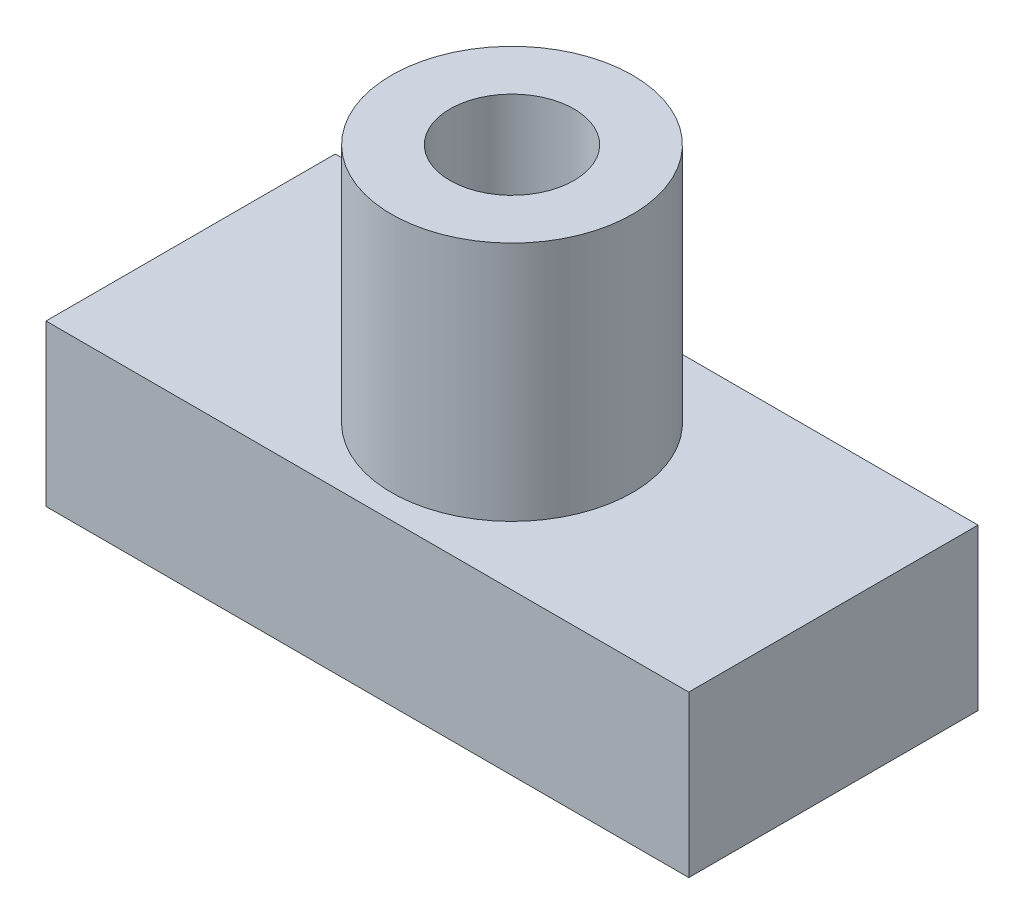
ISO-10303-21;
HEADER;
FILE_DESCRIPTION(('STEP AP214'),'2;1');
FILE_NAME('part.step','',(''),(''),'','','');
FILE_SCHEMA(('AUTOMOTIVE_DESIGN { 1 0 10303 214 1 1 1 1 }'));
ENDSEC;
DATA;
#1=APPLICATION_CONTEXT('core data for automotive mechanical design processes');
#2=APPLICATION_PROTOCOL_DEFINITION('international standard','automotive_design',2000,#1);
#3=PRODUCT_CONTEXT('',#1,'mechanical');
#4=PRODUCT('Part','Part','',(#3));
#5=PRODUCT_RELATED_PRODUCT_CATEGORY('part','',(#4));
#6=PRODUCT_DEFINITION_FORMATION('','',#4);
#7=PRODUCT_DEFINITION_CONTEXT('part definition',#1,'design');
#8=PRODUCT_DEFINITION('design','',#6,#7);
#9=PRODUCT_DEFINITION_SHAPE('','',#8);
#10=(LENGTH_UNIT() NAMED_UNIT(*) SI_UNIT(.MILLI.,.METRE.));
#11=(NAMED_UNIT(*) PLANE_ANGLE_UNIT() SI_UNIT($,.RADIAN.));
#12=(NAMED_UNIT(*) SI_UNIT($,.STERADIAN.) SOLID_ANGLE_UNIT());
#13=UNCERTAINTY_MEASURE_WITH_UNIT(LENGTH_MEASURE(1.E-05),#10,'distance_accuracy_value','');
#14=(GEOMETRIC_REPRESENTATION_CONTEXT(3) GLOBAL_UNCERTAINTY_ASSIGNED_CONTEXT((#13)) GLOBAL_UNIT_ASSIGNED_CONTEXT((#10,
#11,#12)) REPRESENTATION_CONTEXT('',''));
#15=CARTESIAN_POINT('',(0.,0.,0.));
#16=DIRECTION('',(0.,0.,1.));
#17=DIRECTION('',(1.,0.,0.));
#18=AXIS2_PLACEMENT_3D('',#15,#16,#17);
#19=CARTESIAN_POINT('',(0.,6.35,0.));
#20=DIRECTION('',(0.,-1.,0.));
#21=DIRECTION('',(0.,0.,-1.));
#22=AXIS2_PLACEMENT_3D('',#19,#20,#21);
#23=PLANE('',#22);
#24=DIRECTION('',(0.,0.,1.));
#25=VECTOR('',#24,1.);
#26=CARTESIAN_POINT('',(0.,6.35,0.));
#27=LINE('',#26,#25);
#28=CARTESIAN_POINT('',(0.,6.35,-11.43));
#29=VERTEX_POINT('',#28);
#30=CARTESIAN_POINT('',(0.,6.35,0.));
#31=VERTEX_POINT('',#30);
#32=EDGE_CURVE('E140',#29,#31,#27,.T.);
#33=ORIENTED_EDGE('',*,*,#32,.T.);
#34=DIRECTION('',(1.,0.,0.));
#35=VECTOR('',#34,1.);
#36=CARTESIAN_POINT('',(0.,6.35,0.));
#37=LINE('',#36,#35);
#38=CARTESIAN_POINT('',(25.4,6.35,0.));
#39=VERTEX_POINT('',#38);
#40=EDGE_CURVE('E84',#31,#39,#37,.T.);
#41=ORIENTED_EDGE('',*,*,#40,.T.);
#42=DIRECTION('',(0.,0.,-1.));
#43=VECTOR('',#42,1.);
#44=CARTESIAN_POINT('',(25.4,6.35,0.));
#45=LINE('',#44,#43);
#46=CARTESIAN_POINT('',(25.4,6.35,-11.43));
#47=VERTEX_POINT('',#46);
#48=EDGE_CURVE('E143',#39,#47,#45,.T.);
#49=ORIENTED_EDGE('',*,*,#48,.T.);
#50=DIRECTION('',(-1.,0.,0.));
#51=VECTOR('',#50,1.);
#52=CARTESIAN_POINT('',(0.,6.35,-11.43));
#53=LINE('',#52,#51);
#54=EDGE_CURVE('E52',#47,#29,#53,.T.);
#55=ORIENTED_EDGE('',*,*,#54,.T.);
#56=EDGE_LOOP('',(#33,#41,#49,#55));
#57=FACE_BOUND('',#56,.T.);
#58=CARTESIAN_POINT('',(12.7,6.35,-5.715));
#59=DIRECTION('',(0.,-1.,0.));
#60=DIRECTION('',(0.,0.,-1.));
#61=AXIS2_PLACEMENT_3D('',#58,#59,#60);
#62=CIRCLE('',#61,4.76250000000001);
#63=CARTESIAN_POINT('',(12.7,6.35,-10.4775));
#64=VERTEX_POINT('',#63);
#65=EDGE_CURVE('E11',#64,#64,#62,.F.);
#66=ORIENTED_EDGE('',*,*,#65,.F.);
#67=EDGE_LOOP('',(#66));
#68=FACE_BOUND('',#67,.T.);
#69=ADVANCED_FACE('F35',(#57,#68),#23,.F.);
#70=CARTESIAN_POINT('',(0.,6.35,0.));
#71=DIRECTION('',(1.,0.,0.));
#72=DIRECTION('',(0.,0.,-1.));
#73=AXIS2_PLACEMENT_3D('',#70,#71,#72);
#74=PLANE('',#73);
#75=DIRECTION('',(0.,0.,1.));
#76=VECTOR('',#75,1.);
#77=CARTESIAN_POINT('',(0.,0.,0.));
#78=LINE('',#77,#76);
#79=CARTESIAN_POINT('',(0.,0.,-11.43));
#80=VERTEX_POINT('',#79);
#81=CARTESIAN_POINT('',(0.,0.,0.));
#82=VERTEX_POINT('',#81);
#83=EDGE_CURVE('E139',#80,#82,#78,.T.);
#84=ORIENTED_EDGE('',*,*,#83,.T.);
#85=DIRECTION('',(0.,-1.,0.));
#86=VECTOR('',#85,1.);
#87=CARTESIAN_POINT('',(0.,6.35,0.));
#88=LINE('',#87,#86);
#89=EDGE_CURVE('E44',#31,#82,#88,.T.);
#90=ORIENTED_EDGE('',*,*,#89,.F.);
#91=ORIENTED_EDGE('',*,*,#32,.F.);
#92=DIRECTION('',(0.,-1.,0.));
#93=VECTOR('',#92,1.);
#94=CARTESIAN_POINT('',(0.,6.35,-11.43));
#95=LINE('',#94,#93);
#96=EDGE_CURVE('E146',#29,#80,#95,.T.);
#97=ORIENTED_EDGE('',*,*,#96,.T.);
#98=EDGE_LOOP('',(#84,#90,#91,#97));
#99=FACE_BOUND('',#98,.T.);
#100=ADVANCED_FACE('F37',(#99),#74,.F.);
#101=CARTESIAN_POINT('',(0.,6.35,0.));
#102=DIRECTION('',(0.,0.,-1.));
#103=DIRECTION('',(-1.,0.,0.));
#104=AXIS2_PLACEMENT_3D('',#101,#102,#103);
#105=PLANE('',#104);
#106=DIRECTION('',(1.,0.,0.));
#107=VECTOR('',#106,1.);
#108=CARTESIAN_POINT('',(0.,0.,0.));
#109=LINE('',#108,#107);
#110=CARTESIAN_POINT('',(25.4,0.,0.));
#111=VERTEX_POINT('',#110);
#112=EDGE_CURVE('E149',#82,#111,#109,.T.);
#113=ORIENTED_EDGE('',*,*,#112,.T.);
#114=DIRECTION('',(0.,-1.,0.));
#115=VECTOR('',#114,1.);
#116=CARTESIAN_POINT('',(25.4,6.35,0.));
#117=LINE('',#116,#115);
#118=EDGE_CURVE('E156',#39,#111,#117,.T.);
#119=ORIENTED_EDGE('',*,*,#118,.F.);
#120=ORIENTED_EDGE('',*,*,#40,.F.);
#121=ORIENTED_EDGE('',*,*,#89,.T.);
#122=EDGE_LOOP('',(#113,#119,#120,#121));
#123=FACE_BOUND('',#122,.T.);
#124=ADVANCED_FACE('F158',(#123),#105,.F.);
#125=CARTESIAN_POINT('',(25.4,6.35,0.));
#126=DIRECTION('',(-1.,0.,0.));
#127=DIRECTION('',(0.,0.,1.));
#128=AXIS2_PLACEMENT_3D('',#125,#126,#127);
#129=PLANE('',#128);
#130=DIRECTION('',(0.,0.,-1.));
#131=VECTOR('',#130,1.);
#132=CARTESIAN_POINT('',(25.4,0.,0.));
#133=LINE('',#132,#131);
#134=CARTESIAN_POINT('',(25.4,0.,-11.43));
#135=VERTEX_POINT('',#134);
#136=EDGE_CURVE('E70',#111,#135,#133,.T.);
#137=ORIENTED_EDGE('',*,*,#136,.T.);
#138=DIRECTION('',(0.,-1.,0.));
#139=VECTOR('',#138,1.);
#140=CARTESIAN_POINT('',(25.4,6.35,-11.43));
#141=LINE('',#140,#139);
#142=EDGE_CURVE('E154',#47,#135,#141,.T.);
#143=ORIENTED_EDGE('',*,*,#142,.F.);
#144=ORIENTED_EDGE('',*,*,#48,.F.);
#145=ORIENTED_EDGE('',*,*,#118,.T.);
#146=EDGE_LOOP('',(#137,#143,#144,#145));
#147=FACE_BOUND('',#146,.T.);
#148=ADVANCED_FACE('F176',(#147),#129,.F.);
#149=CARTESIAN_POINT('',(0.,6.35,-11.43));
#150=DIRECTION('',(0.,0.,1.));
#151=DIRECTION('',(1.,0.,0.));
#152=AXIS2_PLACEMENT_3D('',#149,#150,#151);
#153=PLANE('',#152);
#154=DIRECTION('',(-1.,0.,0.));
#155=VECTOR('',#154,1.);
#156=CARTESIAN_POINT('',(0.,0.,-11.43));
#157=LINE('',#156,#155);
#158=EDGE_CURVE('E76',#135,#80,#157,.T.);
#159=ORIENTED_EDGE('',*,*,#158,.T.);
#160=ORIENTED_EDGE('',*,*,#96,.F.);
#161=ORIENTED_EDGE('',*,*,#54,.F.);
#162=ORIENTED_EDGE('',*,*,#142,.T.);
#163=EDGE_LOOP('',(#159,#160,#161,#162));
#164=FACE_BOUND('',#163,.T.);
#165=ADVANCED_FACE('F166',(#164),#153,.F.);
#166=CARTESIAN_POINT('',(0.,0.,0.));
#167=DIRECTION('',(0.,-1.,0.));
#168=DIRECTION('',(0.,0.,-1.));
#169=AXIS2_PLACEMENT_3D('',#166,#167,#168);
#170=PLANE('',#169);
#171=CARTESIAN_POINT('',(8.89,0.,-1.905));
#172=DIRECTION('',(0.,-1.,0.));
#173=DIRECTION('',(0.,0.,-1.));
#174=AXIS2_PLACEMENT_3D('',#171,#172,#173);
#175=CIRCLE('',#174,1.4224);
#176=CARTESIAN_POINT('',(8.89,0.,-3.3274));
#177=VERTEX_POINT('',#176);
#178=EDGE_CURVE('E108',#177,#177,#175,.T.);
#179=ORIENTED_EDGE('',*,*,#178,.F.);
#180=EDGE_LOOP('',(#179));
#181=FACE_BOUND('',#180,.T.);
#182=CARTESIAN_POINT('',(8.89,0.,-9.525));
#183=DIRECTION('',(0.,-1.,0.));
#184=DIRECTION('',(0.,0.,-1.));
#185=AXIS2_PLACEMENT_3D('',#182,#183,#184);
#186=CIRCLE('',#185,1.4224);
#187=CARTESIAN_POINT('',(8.89,0.,-10.9474));
#188=VERTEX_POINT('',#187);
#189=EDGE_CURVE('E107',#188,#188,#186,.T.);
#190=ORIENTED_EDGE('',*,*,#189,.F.);
#191=EDGE_LOOP('',(#190));
#192=FACE_BOUND('',#191,.T.);
#193=CARTESIAN_POINT('',(16.51,0.,-9.525));
#194=DIRECTION('',(0.,-1.,0.));
#195=DIRECTION('',(0.,0.,-1.));
#196=AXIS2_PLACEMENT_3D('',#193,#194,#195);
#197=CIRCLE('',#196,1.4224);
#198=CARTESIAN_POINT('',(16.51,0.,-10.9474));
#199=VERTEX_POINT('',#198);
#200=EDGE_CURVE('E118',#199,#199,#197,.T.);
#201=ORIENTED_EDGE('',*,*,#200,.F.);
#202=EDGE_LOOP('',(#201));
#203=FACE_BOUND('',#202,.T.);
#204=CARTESIAN_POINT('',(16.51,0.,-1.905));
#205=DIRECTION('',(0.,-1.,0.));
#206=DIRECTION('',(0.,0.,-1.));
#207=AXIS2_PLACEMENT_3D('',#204,#205,#206);
#208=CIRCLE('',#207,1.4224);
#209=CARTESIAN_POINT('',(16.51,0.,-3.3274));
#210=VERTEX_POINT('',#209);
#211=EDGE_CURVE('E124',#210,#210,#208,.T.);
#212=ORIENTED_EDGE('',*,*,#211,.F.);
#213=EDGE_LOOP('',(#212));
#214=FACE_BOUND('',#213,.T.);
#215=CARTESIAN_POINT('',(12.7,0.,-5.715));
#216=DIRECTION('',(0.,1.,0.));
#217=DIRECTION('',(0.,0.,1.));
#218=AXIS2_PLACEMENT_3D('',#215,#216,#217);
#219=CIRCLE('',#218,2.4511);
#220=CARTESIAN_POINT('',(12.7,0.,-3.2639));
#221=VERTEX_POINT('',#220);
#222=EDGE_CURVE('E131',#221,#221,#219,.T.);
#223=ORIENTED_EDGE('',*,*,#222,.T.);
#224=EDGE_LOOP('',(#223));
#225=FACE_BOUND('',#224,.T.);
#226=ORIENTED_EDGE('',*,*,#83,.F.);
#227=ORIENTED_EDGE('',*,*,#158,.F.);
#228=ORIENTED_EDGE('',*,*,#136,.F.);
#229=ORIENTED_EDGE('',*,*,#112,.F.);
#230=EDGE_LOOP('',(#226,#227,#228,#229));
#231=FACE_BOUND('',#230,.T.);
#232=ADVANCED_FACE('F163',(#181,#192,#203,#214,#225,#231),#170,.T.);
#233=CARTESIAN_POINT('',(12.7,15.875,-5.715));
#234=DIRECTION('',(0.,-1.,0.));
#235=DIRECTION('',(0.,0.,-1.));
#236=AXIS2_PLACEMENT_3D('',#233,#234,#235);
#237=CYLINDRICAL_SURFACE('',#236,4.76250000000001);
#238=CARTESIAN_POINT('',(12.7,15.875,-5.715));
#239=DIRECTION('',(0.,1.,0.));
#240=DIRECTION('',(0.,0.,1.));
#241=AXIS2_PLACEMENT_3D('',#238,#239,#240);
#242=CIRCLE('',#241,4.76250000000001);
#243=CARTESIAN_POINT('',(12.7,15.875,-10.4775));
#244=VERTEX_POINT('',#243);
#245=EDGE_CURVE('E134',#244,#244,#242,.T.);
#246=CARTESIAN_POINT('',(12.7,15.875,-10.4775));
#247=CARTESIAN_POINT('',(12.7,15.77578125,-10.4775));
#248=CARTESIAN_POINT('',(12.7,15.6765625,-10.4775));
#249=CARTESIAN_POINT('',(12.7,15.478125,-10.4775));
#250=CARTESIAN_POINT('',(12.7,15.37890625,-10.4775));
#251=CARTESIAN_POINT('',(12.7,15.18046875,-10.4775));
#252=CARTESIAN_POINT('',(12.7,15.08125,-10.4775));
#253=CARTESIAN_POINT('',(12.7,14.8828125,-10.4775));
#254=CARTESIAN_POINT('',(12.7,14.78359375,-10.4775));
#255=CARTESIAN_POINT('',(12.7,14.58515625,-10.4775));
#256=CARTESIAN_POINT('',(12.7,14.4859375,-10.4775));
#257=CARTESIAN_POINT('',(12.7,14.2875,-10.4775));
#258=CARTESIAN_POINT('',(12.7,14.18828125,-10.4775));
#259=CARTESIAN_POINT('',(12.7,13.98984375,-10.4775));
#260=CARTESIAN_POINT('',(12.7,13.890625,-10.4775));
#261=CARTESIAN_POINT('',(12.7,13.6921875,-10.4775));
#262=CARTESIAN_POINT('',(12.7,13.59296875,-10.4775));
#263=CARTESIAN_POINT('',(12.7,13.39453125,-10.4775));
#264=CARTESIAN_POINT('',(12.7,13.2953125,-10.4775));
#265=CARTESIAN_POINT('',(12.7,13.096875,-10.4775));
#266=CARTESIAN_POINT('',(12.7,12.99765625,-10.4775));
#267=CARTESIAN_POINT('',(12.7,12.79921875,-10.4775));
#268=CARTESIAN_POINT('',(12.7,12.7,-10.4775));
#269=CARTESIAN_POINT('',(12.7,12.5015625,-10.4775));
#270=CARTESIAN_POINT('',(12.7,12.40234375,-10.4775));
#271=CARTESIAN_POINT('',(12.7,12.20390625,-10.4775));
#272=CARTESIAN_POINT('',(12.7,12.1046875,-10.4775));
#273=CARTESIAN_POINT('',(12.7,11.90625,-10.4775));
#274=CARTESIAN_POINT('',(12.7,11.80703125,-10.4775));
#275=CARTESIAN_POINT('',(12.7,11.60859375,-10.4775));
#276=CARTESIAN_POINT('',(12.7,11.509375,-10.4775));
#277=CARTESIAN_POINT('',(12.7,11.3109375,-10.4775));
#278=CARTESIAN_POINT('',(12.7,11.21171875,-10.4775));
#279=CARTESIAN_POINT('',(12.7,11.01328125,-10.4775));
#280=CARTESIAN_POINT('',(12.7,10.9140625,-10.4775));
#281=CARTESIAN_POINT('',(12.7,10.715625,-10.4775));
#282=CARTESIAN_POINT('',(12.7,10.61640625,-10.4775));
#283=CARTESIAN_POINT('',(12.7,10.41796875,-10.4775));
#284=CARTESIAN_POINT('',(12.7,10.31875,-10.4775));
#285=CARTESIAN_POINT('',(12.7,10.1203125,-10.4775));
#286=CARTESIAN_POINT('',(12.7,10.02109375,-10.4775));
#287=CARTESIAN_POINT('',(12.7,9.82265625,-10.4775));
#288=CARTESIAN_POINT('',(12.7,9.7234375,-10.4775));
#289=CARTESIAN_POINT('',(12.7,9.525,-10.4775));
#290=CARTESIAN_POINT('',(12.7,9.42578125,-10.4775));
#291=CARTESIAN_POINT('',(12.7,9.22734375,-10.4775));
#292=CARTESIAN_POINT('',(12.7,9.128125,-10.4775));
#293=CARTESIAN_POINT('',(12.7,8.9296875,-10.4775));
#294=CARTESIAN_POINT('',(12.7,8.83046875,-10.4775));
#295=CARTESIAN_POINT('',(12.7,8.63203125,-10.4775));
#296=CARTESIAN_POINT('',(12.7,8.5328125,-10.4775));
#297=CARTESIAN_POINT('',(12.7,8.334375,-10.4775));
#298=CARTESIAN_POINT('',(12.7,8.23515625,-10.4775));
#299=CARTESIAN_POINT('',(12.7,8.03671875,-10.4775));
#300=CARTESIAN_POINT('',(12.7,7.9375,-10.4775));
#301=CARTESIAN_POINT('',(12.7,7.7390625,-10.4775));
#302=CARTESIAN_POINT('',(12.7,7.63984375,-10.4775));
#303=CARTESIAN_POINT('',(12.7,7.44140625,-10.4775));
#304=CARTESIAN_POINT('',(12.7,7.3421875,-10.4775));
#305=CARTESIAN_POINT('',(12.7,7.14375,-10.4775));
#306=CARTESIAN_POINT('',(12.7,7.04453125,-10.4775));
#307=CARTESIAN_POINT('',(12.7,6.84609375,-10.4775));
#308=CARTESIAN_POINT('',(12.7,6.746875,-10.4775));
#309=CARTESIAN_POINT('',(12.7,6.5484375,-10.4775));
#310=CARTESIAN_POINT('',(12.7,6.44921875,-10.4775));
#311=CARTESIAN_POINT('',(12.7,6.35,-10.4775));
#312=B_SPLINE_CURVE_WITH_KNOTS('',3,(#246,#247,#248,#249,#250,#251,#252,#253,#254,#255,#256,
#257,#258,#259,#260,#261,#262,#263,#264,#265,#266,#267,#268,#269,#270,#271,#272,#273,#274,#275,
#276,#277,#278,#279,#280,#281,#282,#283,#284,#285,#286,#287,#288,#289,#290,#291,#292,#293,#294,
#295,#296,#297,#298,#299,#300,#301,#302,#303,#304,#305,#306,#307,#308,#309,#310,#311),
.UNSPECIFIED.,.F.,.F.,(4,2,2,2,2,2,2,2,2,2,2,2,2,2,2,2,2,2,2,2,2,2,2,2,2,2,2,2,2,2,2,2,4),(0.,
0.297656250000002,0.595312500000002,0.892968750000002,1.190625,1.48828125,1.7859375,2.08359375,
2.38125,2.67890625,2.9765625,3.27421875,3.571875,3.86953125,4.1671875,4.46484375,4.7625,
5.06015625,5.3578125,5.65546875,5.953125,6.25078125,6.5484375,6.84609375,7.14375,7.44140625,
7.7390625,8.03671875,8.334375,8.63203125,8.9296875,9.22734375,9.525),.UNSPECIFIED.);
#313=EDGE_CURVE('BSEAM165',#244,#64,#312,.T.);
#314=ORIENTED_EDGE('',*,*,#245,.F.);
#315=ORIENTED_EDGE('',*,*,#65,.T.);
#316=ORIENTED_EDGE('',*,*,#313,.T.);
#317=ORIENTED_EDGE('',*,*,#313,.F.);
#318=EDGE_LOOP('',(#314,#316,#315,#317));
#319=FACE_BOUND('',#318,.T.);
#320=ADVANCED_FACE('F165',(#319),#237,.T.);
#321=CARTESIAN_POINT('',(12.7,15.875,-5.715));
#322=DIRECTION('',(0.,1.,0.));
#323=DIRECTION('',(0.,0.,1.));
#324=AXIS2_PLACEMENT_3D('',#321,#322,#323);
#325=PLANE('',#324);
#326=CARTESIAN_POINT('',(12.7,15.875,-5.715));
#327=DIRECTION('',(0.,1.,0.));
#328=DIRECTION('',(0.,0.,1.));
#329=AXIS2_PLACEMENT_3D('',#326,#327,#328);
#330=CIRCLE('',#329,2.4511);
#331=CARTESIAN_POINT('',(12.7,15.875,-3.2639));
#332=VERTEX_POINT('',#331);
#333=EDGE_CURVE('E130',#332,#332,#330,.T.);
#334=ORIENTED_EDGE('',*,*,#333,.F.);
#335=EDGE_LOOP('',(#334));
#336=FACE_BOUND('',#335,.T.);
#337=ORIENTED_EDGE('',*,*,#245,.T.);
#338=EDGE_LOOP('',(#337));
#339=FACE_BOUND('',#338,.T.);
#340=ADVANCED_FACE('F173',(#336,#339),#325,.T.);
#341=CARTESIAN_POINT('',(12.7,0.,-5.715));
#342=DIRECTION('',(0.,1.,0.));
#343=DIRECTION('',(0.,0.,1.));
#344=AXIS2_PLACEMENT_3D('',#341,#342,#343);
#345=CYLINDRICAL_SURFACE('',#344,2.4511);
#346=ORIENTED_EDGE('',*,*,#222,.F.);
#347=EDGE_LOOP('',(#346));
#348=FACE_BOUND('',#347,.T.);
#349=ORIENTED_EDGE('',*,*,#333,.T.);
#350=EDGE_LOOP('',(#349));
#351=FACE_BOUND('',#350,.T.);
#352=ADVANCED_FACE('F189',(#348,#351),#345,.F.);
#353=CARTESIAN_POINT('',(16.51,3.96875,-1.905));
#354=DIRECTION('',(0.,-1.,0.));
#355=DIRECTION('',(0.,0.,-1.));
#356=AXIS2_PLACEMENT_3D('',#353,#354,#355);
#357=CONICAL_SURFACE('',#356,1.4224,1.02974425867665);
#358=CARTESIAN_POINT('',(16.51,4.82341414450481,-1.905));
#359=VERTEX_POINT('',#358);
#360=VERTEX_LOOP('',#359);
#361=FACE_BOUND('',#360,.T.);
#362=CARTESIAN_POINT('',(16.51,3.96875,-1.905));
#363=DIRECTION('',(0.,-1.,0.));
#364=DIRECTION('',(0.,0.,-1.));
#365=AXIS2_PLACEMENT_3D('',#362,#363,#364);
#366=CIRCLE('',#365,1.4224);
#367=CARTESIAN_POINT('',(16.51,3.96875,-3.3274));
#368=VERTEX_POINT('',#367);
#369=EDGE_CURVE('E127',#368,#368,#366,.T.);
#370=ORIENTED_EDGE('',*,*,#369,.T.);
#371=EDGE_LOOP('',(#370));
#372=FACE_BOUND('',#371,.T.);
#373=ADVANCED_FACE('F193',(#361,#372),#357,.F.);
#374=CARTESIAN_POINT('',(16.51,0.,-1.905));
#375=DIRECTION('',(0.,-1.,0.));
#376=DIRECTION('',(0.,0.,-1.));
#377=AXIS2_PLACEMENT_3D('',#374,#375,#376);
#378=CYLINDRICAL_SURFACE('',#377,1.4224);
#379=ORIENTED_EDGE('',*,*,#369,.F.);
#380=EDGE_LOOP('',(#379));
#381=FACE_BOUND('',#380,.T.);
#382=ORIENTED_EDGE('',*,*,#211,.T.);
#383=EDGE_LOOP('',(#382));
#384=FACE_BOUND('',#383,.T.);
#385=ADVANCED_FACE('F197',(#381,#384),#378,.F.);
#386=CARTESIAN_POINT('',(16.51,3.96875,-9.525));
#387=DIRECTION('',(0.,-1.,0.));
#388=DIRECTION('',(0.,0.,-1.));
#389=AXIS2_PLACEMENT_3D('',#386,#387,#388);
#390=CONICAL_SURFACE('',#389,1.4224,1.02974425867665);
#391=CARTESIAN_POINT('',(16.51,4.82341414450481,-9.525));
#392=VERTEX_POINT('',#391);
#393=VERTEX_LOOP('',#392);
#394=FACE_BOUND('',#393,.T.);
#395=CARTESIAN_POINT('',(16.51,3.96875,-9.525));
#396=DIRECTION('',(0.,-1.,0.));
#397=DIRECTION('',(0.,0.,-1.));
#398=AXIS2_PLACEMENT_3D('',#395,#396,#397);
#399=CIRCLE('',#398,1.4224);
#400=CARTESIAN_POINT('',(16.51,3.96875,-10.9474));
#401=VERTEX_POINT('',#400);
#402=EDGE_CURVE('E121',#401,#401,#399,.T.);
#403=ORIENTED_EDGE('',*,*,#402,.T.);
#404=EDGE_LOOP('',(#403));
#405=FACE_BOUND('',#404,.T.);
#406=ADVANCED_FACE('F201',(#394,#405),#390,.F.);
#407=CARTESIAN_POINT('',(16.51,0.,-9.525));
#408=DIRECTION('',(0.,-1.,0.));
#409=DIRECTION('',(0.,0.,-1.));
#410=AXIS2_PLACEMENT_3D('',#407,#408,#409);
#411=CYLINDRICAL_SURFACE('',#410,1.4224);
#412=ORIENTED_EDGE('',*,*,#402,.F.);
#413=EDGE_LOOP('',(#412));
#414=FACE_BOUND('',#413,.T.);
#415=ORIENTED_EDGE('',*,*,#200,.T.);
#416=EDGE_LOOP('',(#415));
#417=FACE_BOUND('',#416,.T.);
#418=ADVANCED_FACE('F205',(#414,#417),#411,.F.);
#419=CARTESIAN_POINT('',(8.89,3.96875,-9.525));
#420=DIRECTION('',(0.,-1.,0.));
#421=DIRECTION('',(0.,0.,-1.));
#422=AXIS2_PLACEMENT_3D('',#419,#420,#421);
#423=CONICAL_SURFACE('',#422,1.4224,1.02974425867665);
#424=CARTESIAN_POINT('',(8.89,4.82341414450481,-9.525));
#425=VERTEX_POINT('',#424);
#426=VERTEX_LOOP('',#425);
#427=FACE_BOUND('',#426,.T.);
#428=CARTESIAN_POINT('',(8.89,3.96875,-9.525));
#429=DIRECTION('',(0.,-1.,0.));
#430=DIRECTION('',(0.,0.,-1.));
#431=AXIS2_PLACEMENT_3D('',#428,#429,#430);
#432=CIRCLE('',#431,1.4224);
#433=CARTESIAN_POINT('',(8.89,3.96875,-10.9474));
#434=VERTEX_POINT('',#433);
#435=EDGE_CURVE('E111',#434,#434,#432,.T.);
#436=ORIENTED_EDGE('',*,*,#435,.T.);
#437=EDGE_LOOP('',(#436));
#438=FACE_BOUND('',#437,.T.);
#439=ADVANCED_FACE('F209',(#427,#438),#423,.F.);
#440=CARTESIAN_POINT('',(8.89,0.,-9.525));
#441=DIRECTION('',(0.,-1.,0.));
#442=DIRECTION('',(0.,0.,-1.));
#443=AXIS2_PLACEMENT_3D('',#440,#441,#442);
#444=CYLINDRICAL_SURFACE('',#443,1.4224);
#445=ORIENTED_EDGE('',*,*,#435,.F.);
#446=EDGE_LOOP('',(#445));
#447=FACE_BOUND('',#446,.T.);
#448=ORIENTED_EDGE('',*,*,#189,.T.);
#449=EDGE_LOOP('',(#448));
#450=FACE_BOUND('',#449,.T.);
#451=ADVANCED_FACE('F101',(#447,#450),#444,.F.);
#452=CARTESIAN_POINT('',(8.89,3.96875,-1.905));
#453=DIRECTION('',(0.,-1.,0.));
#454=DIRECTION('',(0.,0.,-1.));
#455=AXIS2_PLACEMENT_3D('',#452,#453,#454);
#456=CONICAL_SURFACE('',#455,1.4224,1.02974425867665);
#457=CARTESIAN_POINT('',(8.89,4.82341414450481,-1.905));
#458=VERTEX_POINT('',#457);
#459=VERTEX_LOOP('',#458);
#460=FACE_BOUND('',#459,.T.);
#461=CARTESIAN_POINT('',(8.89,3.96875,-1.905));
#462=DIRECTION('',(0.,-1.,0.));
#463=DIRECTION('',(0.,0.,-1.));
#464=AXIS2_PLACEMENT_3D('',#461,#462,#463);
#465=CIRCLE('',#464,1.4224);
#466=CARTESIAN_POINT('',(8.89,3.96875,-3.3274));
#467=VERTEX_POINT('',#466);
#468=EDGE_CURVE('E105',#467,#467,#465,.T.);
#469=ORIENTED_EDGE('',*,*,#468,.T.);
#470=EDGE_LOOP('',(#469));
#471=FACE_BOUND('',#470,.T.);
#472=ADVANCED_FACE('F97',(#460,#471),#456,.F.);
#473=CARTESIAN_POINT('',(8.89,0.,-1.905));
#474=DIRECTION('',(0.,-1.,0.));
#475=DIRECTION('',(0.,0.,-1.));
#476=AXIS2_PLACEMENT_3D('',#473,#474,#475);
#477=CYLINDRICAL_SURFACE('',#476,1.4224);
#478=ORIENTED_EDGE('',*,*,#468,.F.);
#479=EDGE_LOOP('',(#478));
#480=FACE_BOUND('',#479,.T.);
#481=ORIENTED_EDGE('',*,*,#178,.T.);
#482=EDGE_LOOP('',(#481));
#483=FACE_BOUND('',#482,.T.);
#484=ADVANCED_FACE('F100',(#480,#483),#477,.F.);
#485=CLOSED_SHELL('',(#69,#100,#124,#148,#165,#232,#320,#340,#352,#373,#385,#406,#418,#439,#451,
#472,#484));
#486=MANIFOLD_SOLID_BREP('B2',#485);
#487=ADVANCED_BREP_SHAPE_REPRESENTATION('',(#18,#486),#14);
#488=SHAPE_DEFINITION_REPRESENTATION(#9,#487);
ENDSEC;
END-ISO-10303-21;
